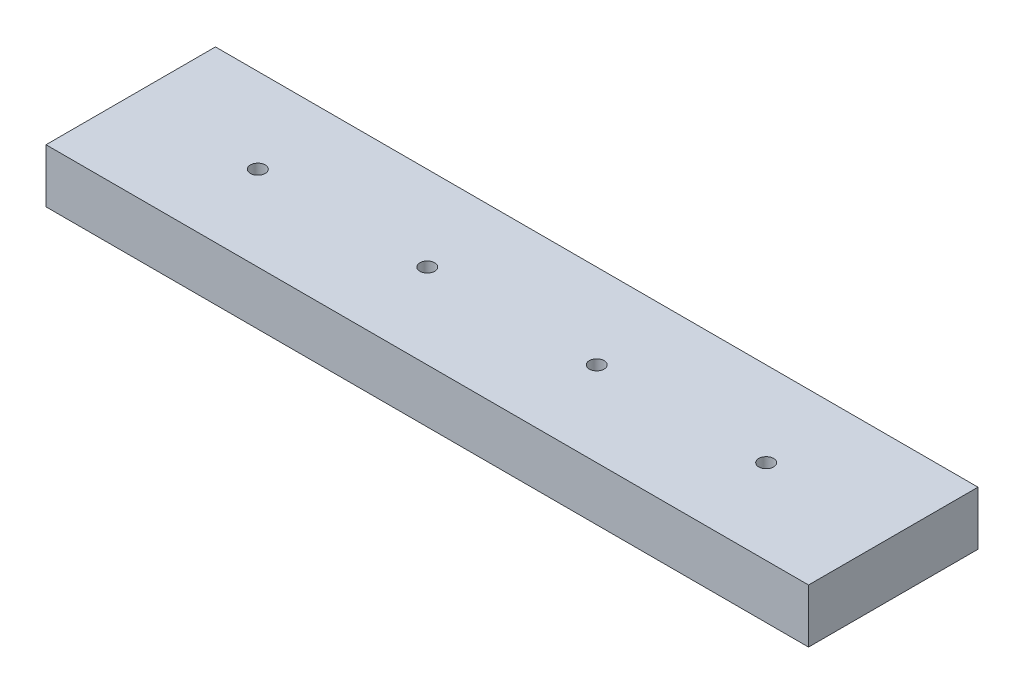
ISO-10303-21;
HEADER;
FILE_DESCRIPTION(('STEP AP214'),'2;1');
FILE_NAME('part.step','',(''),(''),'','','');
FILE_SCHEMA(('AUTOMOTIVE_DESIGN { 1 0 10303 214 1 1 1 1 }'));
ENDSEC;
DATA;
#1=APPLICATION_CONTEXT('core data for automotive mechanical design processes');
#2=APPLICATION_PROTOCOL_DEFINITION('international standard','automotive_design',2000,#1);
#3=PRODUCT_CONTEXT('',#1,'mechanical');
#4=PRODUCT('Part','Part','',(#3));
#5=PRODUCT_RELATED_PRODUCT_CATEGORY('part','',(#4));
#6=PRODUCT_DEFINITION_FORMATION('','',#4);
#7=PRODUCT_DEFINITION_CONTEXT('part definition',#1,'design');
#8=PRODUCT_DEFINITION('design','',#6,#7);
#9=PRODUCT_DEFINITION_SHAPE('','',#8);
#10=(LENGTH_UNIT() NAMED_UNIT(*) SI_UNIT(.MILLI.,.METRE.));
#11=(NAMED_UNIT(*) PLANE_ANGLE_UNIT() SI_UNIT($,.RADIAN.));
#12=(NAMED_UNIT(*) SI_UNIT($,.STERADIAN.) SOLID_ANGLE_UNIT());
#13=UNCERTAINTY_MEASURE_WITH_UNIT(LENGTH_MEASURE(1.E-05),#10,'distance_accuracy_value','');
#14=(GEOMETRIC_REPRESENTATION_CONTEXT(3) GLOBAL_UNCERTAINTY_ASSIGNED_CONTEXT((#13)) GLOBAL_UNIT_ASSIGNED_CONTEXT((#10,
#11,#12)) REPRESENTATION_CONTEXT('',''));
#15=CARTESIAN_POINT('',(0.,0.,0.));
#16=DIRECTION('',(0.,0.,1.));
#17=DIRECTION('',(1.,0.,0.));
#18=AXIS2_PLACEMENT_3D('',#15,#16,#17);
#19=CARTESIAN_POINT('',(-45.,6.35,10.));
#20=DIRECTION('',(1.,0.,0.));
#21=DIRECTION('',(0.,0.,-1.));
#22=AXIS2_PLACEMENT_3D('',#19,#20,#21);
#23=PLANE('',#22);
#24=DIRECTION('',(0.,0.,1.));
#25=VECTOR('',#24,1.);
#26=CARTESIAN_POINT('',(-45.,0.,10.));
#27=LINE('',#26,#25);
#28=CARTESIAN_POINT('',(-45.,0.,-9.99999999999999));
#29=VERTEX_POINT('',#28);
#30=CARTESIAN_POINT('',(-45.,0.,10.));
#31=VERTEX_POINT('',#30);
#32=EDGE_CURVE('E96',#29,#31,#27,.T.);
#33=ORIENTED_EDGE('',*,*,#32,.T.);
#34=DIRECTION('',(0.,-1.,0.));
#35=VECTOR('',#34,1.);
#36=CARTESIAN_POINT('',(-45.,6.35,10.));
#37=LINE('',#36,#35);
#38=CARTESIAN_POINT('',(-45.,6.35,10.));
#39=VERTEX_POINT('',#38);
#40=EDGE_CURVE('E11',#39,#31,#37,.T.);
#41=ORIENTED_EDGE('',*,*,#40,.F.);
#42=DIRECTION('',(0.,0.,1.));
#43=VECTOR('',#42,1.);
#44=CARTESIAN_POINT('',(-45.,6.35,10.));
#45=LINE('',#44,#43);
#46=CARTESIAN_POINT('',(-45.,6.35,-9.99999999999999));
#47=VERTEX_POINT('',#46);
#48=EDGE_CURVE('E84',#47,#39,#45,.T.);
#49=ORIENTED_EDGE('',*,*,#48,.F.);
#50=DIRECTION('',(0.,-1.,0.));
#51=VECTOR('',#50,1.);
#52=CARTESIAN_POINT('',(-45.,6.35,-9.99999999999999));
#53=LINE('',#52,#51);
#54=EDGE_CURVE('E92',#47,#29,#53,.T.);
#55=ORIENTED_EDGE('',*,*,#54,.T.);
#56=EDGE_LOOP('',(#33,#41,#49,#55));
#57=FACE_BOUND('',#56,.T.);
#58=ADVANCED_FACE('F33',(#57),#23,.F.);
#59=CARTESIAN_POINT('',(45.,6.35,9.99999999999999));
#60=DIRECTION('',(0.,0.,-1.));
#61=DIRECTION('',(-1.,0.,0.));
#62=AXIS2_PLACEMENT_3D('',#59,#60,#61);
#63=PLANE('',#62);
#64=DIRECTION('',(1.,0.,0.));
#65=VECTOR('',#64,1.);
#66=CARTESIAN_POINT('',(45.,0.,9.99999999999999));
#67=LINE('',#66,#65);
#68=CARTESIAN_POINT('',(45.,0.,9.99999999999999));
#69=VERTEX_POINT('',#68);
#70=EDGE_CURVE('E88',#31,#69,#67,.T.);
#71=ORIENTED_EDGE('',*,*,#70,.T.);
#72=DIRECTION('',(0.,-1.,0.));
#73=VECTOR('',#72,1.);
#74=CARTESIAN_POINT('',(45.,6.35,9.99999999999999));
#75=LINE('',#74,#73);
#76=CARTESIAN_POINT('',(45.,6.35,9.99999999999999));
#77=VERTEX_POINT('',#76);
#78=EDGE_CURVE('E41',#77,#69,#75,.T.);
#79=ORIENTED_EDGE('',*,*,#78,.F.);
#80=DIRECTION('',(1.,0.,0.));
#81=VECTOR('',#80,1.);
#82=CARTESIAN_POINT('',(45.,6.35,9.99999999999999));
#83=LINE('',#82,#81);
#84=EDGE_CURVE('E79',#39,#77,#83,.T.);
#85=ORIENTED_EDGE('',*,*,#84,.F.);
#86=ORIENTED_EDGE('',*,*,#40,.T.);
#87=EDGE_LOOP('',(#71,#79,#85,#86));
#88=FACE_BOUND('',#87,.T.);
#89=ADVANCED_FACE('F87',(#88),#63,.F.);
#90=CARTESIAN_POINT('',(45.,6.35,9.99999999999999));
#91=DIRECTION('',(-1.,0.,0.));
#92=DIRECTION('',(0.,0.,1.));
#93=AXIS2_PLACEMENT_3D('',#90,#91,#92);
#94=PLANE('',#93);
#95=DIRECTION('',(0.,0.,-1.));
#96=VECTOR('',#95,1.);
#97=CARTESIAN_POINT('',(45.,0.,9.99999999999999));
#98=LINE('',#97,#96);
#99=CARTESIAN_POINT('',(45.,0.,-10.));
#100=VERTEX_POINT('',#99);
#101=EDGE_CURVE('E66',#69,#100,#98,.T.);
#102=ORIENTED_EDGE('',*,*,#101,.T.);
#103=DIRECTION('',(0.,-1.,0.));
#104=VECTOR('',#103,1.);
#105=CARTESIAN_POINT('',(45.,6.35,-10.));
#106=LINE('',#105,#104);
#107=CARTESIAN_POINT('',(45.,6.35,-10.));
#108=VERTEX_POINT('',#107);
#109=EDGE_CURVE('E89',#108,#100,#106,.T.);
#110=ORIENTED_EDGE('',*,*,#109,.F.);
#111=DIRECTION('',(0.,0.,-1.));
#112=VECTOR('',#111,1.);
#113=CARTESIAN_POINT('',(45.,6.35,9.99999999999999));
#114=LINE('',#113,#112);
#115=EDGE_CURVE('E82',#77,#108,#114,.T.);
#116=ORIENTED_EDGE('',*,*,#115,.F.);
#117=ORIENTED_EDGE('',*,*,#78,.T.);
#118=EDGE_LOOP('',(#102,#110,#116,#117));
#119=FACE_BOUND('',#118,.T.);
#120=ADVANCED_FACE('F90',(#119),#94,.F.);
#121=CARTESIAN_POINT('',(45.,6.35,-10.));
#122=DIRECTION('',(0.,0.,1.));
#123=DIRECTION('',(1.,0.,0.));
#124=AXIS2_PLACEMENT_3D('',#121,#122,#123);
#125=PLANE('',#124);
#126=DIRECTION('',(-1.,0.,0.));
#127=VECTOR('',#126,1.);
#128=CARTESIAN_POINT('',(45.,0.,-10.));
#129=LINE('',#128,#127);
#130=EDGE_CURVE('E72',#100,#29,#129,.T.);
#131=ORIENTED_EDGE('',*,*,#130,.T.);
#132=ORIENTED_EDGE('',*,*,#54,.F.);
#133=DIRECTION('',(-1.,0.,0.));
#134=VECTOR('',#133,1.);
#135=CARTESIAN_POINT('',(45.,6.35,-10.));
#136=LINE('',#135,#134);
#137=EDGE_CURVE('E49',#108,#47,#136,.T.);
#138=ORIENTED_EDGE('',*,*,#137,.F.);
#139=ORIENTED_EDGE('',*,*,#109,.T.);
#140=EDGE_LOOP('',(#131,#132,#138,#139));
#141=FACE_BOUND('',#140,.T.);
#142=ADVANCED_FACE('F104',(#141),#125,.F.);
#143=CARTESIAN_POINT('',(0.,6.35,0.));
#144=DIRECTION('',(0.,1.,0.));
#145=DIRECTION('',(0.,0.,1.));
#146=AXIS2_PLACEMENT_3D('',#143,#144,#145);
#147=PLANE('',#146);
#148=CARTESIAN_POINT('',(-30.,6.35,0.));
#149=DIRECTION('',(0.,1.,0.));
#150=DIRECTION('',(0.,0.,1.));
#151=AXIS2_PLACEMENT_3D('',#148,#149,#150);
#152=CIRCLE('',#151,0.875000000000001);
#153=CARTESIAN_POINT('',(-30.,6.35,0.874999999999994));
#154=VERTEX_POINT('',#153);
#155=EDGE_CURVE('E130',#154,#154,#152,.T.);
#156=ORIENTED_EDGE('',*,*,#155,.F.);
#157=EDGE_LOOP('',(#156));
#158=FACE_BOUND('',#157,.T.);
#159=CARTESIAN_POINT('',(-10.,6.35,0.));
#160=DIRECTION('',(0.,1.,0.));
#161=DIRECTION('',(0.,0.,1.));
#162=AXIS2_PLACEMENT_3D('',#159,#160,#161);
#163=CIRCLE('',#162,0.874999999999999);
#164=CARTESIAN_POINT('',(-10.,6.35,0.874999999999992));
#165=VERTEX_POINT('',#164);
#166=EDGE_CURVE('E124',#165,#165,#163,.T.);
#167=ORIENTED_EDGE('',*,*,#166,.F.);
#168=EDGE_LOOP('',(#167));
#169=FACE_BOUND('',#168,.T.);
#170=CARTESIAN_POINT('',(30.,6.35,0.));
#171=DIRECTION('',(0.,1.,0.));
#172=DIRECTION('',(0.,0.,1.));
#173=AXIS2_PLACEMENT_3D('',#170,#171,#172);
#174=CIRCLE('',#173,0.875000000000001);
#175=CARTESIAN_POINT('',(30.,6.35,0.874999999999987));
#176=VERTEX_POINT('',#175);
#177=EDGE_CURVE('E118',#176,#176,#174,.T.);
#178=ORIENTED_EDGE('',*,*,#177,.F.);
#179=EDGE_LOOP('',(#178));
#180=FACE_BOUND('',#179,.T.);
#181=CARTESIAN_POINT('',(10.,6.35,0.));
#182=DIRECTION('',(0.,1.,0.));
#183=DIRECTION('',(0.,0.,1.));
#184=AXIS2_PLACEMENT_3D('',#181,#182,#183);
#185=CIRCLE('',#184,0.874999999999999);
#186=CARTESIAN_POINT('',(10.,6.35,0.874999999999989));
#187=VERTEX_POINT('',#186);
#188=EDGE_CURVE('E112',#187,#187,#185,.T.);
#189=ORIENTED_EDGE('',*,*,#188,.F.);
#190=EDGE_LOOP('',(#189));
#191=FACE_BOUND('',#190,.T.);
#192=ORIENTED_EDGE('',*,*,#48,.T.);
#193=ORIENTED_EDGE('',*,*,#84,.T.);
#194=ORIENTED_EDGE('',*,*,#115,.T.);
#195=ORIENTED_EDGE('',*,*,#137,.T.);
#196=EDGE_LOOP('',(#192,#193,#194,#195));
#197=FACE_BOUND('',#196,.T.);
#198=ADVANCED_FACE('F80',(#158,#169,#180,#191,#197),#147,.T.);
#199=CARTESIAN_POINT('',(0.,0.,0.));
#200=DIRECTION('',(0.,1.,0.));
#201=DIRECTION('',(0.,0.,1.));
#202=AXIS2_PLACEMENT_3D('',#199,#200,#201);
#203=PLANE('',#202);
#204=CARTESIAN_POINT('',(-30.,0.,0.));
#205=DIRECTION('',(0.,1.,0.));
#206=DIRECTION('',(0.,0.,1.));
#207=AXIS2_PLACEMENT_3D('',#204,#205,#206);
#208=CIRCLE('',#207,0.874999999999997);
#209=CARTESIAN_POINT('',(-30.,0.,0.87499999999999));
#210=VERTEX_POINT('',#209);
#211=EDGE_CURVE('E127',#210,#210,#208,.T.);
#212=ORIENTED_EDGE('',*,*,#211,.T.);
#213=EDGE_LOOP('',(#212));
#214=FACE_BOUND('',#213,.T.);
#215=CARTESIAN_POINT('',(-10.,0.,0.));
#216=DIRECTION('',(0.,1.,0.));
#217=DIRECTION('',(0.,0.,1.));
#218=AXIS2_PLACEMENT_3D('',#215,#216,#217);
#219=CIRCLE('',#218,0.874999999999999);
#220=CARTESIAN_POINT('',(-10.,0.,0.874999999999992));
#221=VERTEX_POINT('',#220);
#222=EDGE_CURVE('E121',#221,#221,#219,.T.);
#223=ORIENTED_EDGE('',*,*,#222,.T.);
#224=EDGE_LOOP('',(#223));
#225=FACE_BOUND('',#224,.T.);
#226=CARTESIAN_POINT('',(30.,0.,0.));
#227=DIRECTION('',(0.,1.,0.));
#228=DIRECTION('',(0.,0.,1.));
#229=AXIS2_PLACEMENT_3D('',#226,#227,#228);
#230=CIRCLE('',#229,0.874999999999997);
#231=CARTESIAN_POINT('',(30.,0.,0.874999999999983));
#232=VERTEX_POINT('',#231);
#233=EDGE_CURVE('E115',#232,#232,#230,.T.);
#234=ORIENTED_EDGE('',*,*,#233,.T.);
#235=EDGE_LOOP('',(#234));
#236=FACE_BOUND('',#235,.T.);
#237=CARTESIAN_POINT('',(10.,0.,0.));
#238=DIRECTION('',(0.,1.,0.));
#239=DIRECTION('',(0.,0.,1.));
#240=AXIS2_PLACEMENT_3D('',#237,#238,#239);
#241=CIRCLE('',#240,0.874999999999999);
#242=CARTESIAN_POINT('',(10.,0.,0.874999999999989));
#243=VERTEX_POINT('',#242);
#244=EDGE_CURVE('E99',#243,#243,#241,.T.);
#245=ORIENTED_EDGE('',*,*,#244,.T.);
#246=EDGE_LOOP('',(#245));
#247=FACE_BOUND('',#246,.T.);
#248=ORIENTED_EDGE('',*,*,#32,.F.);
#249=ORIENTED_EDGE('',*,*,#130,.F.);
#250=ORIENTED_EDGE('',*,*,#101,.F.);
#251=ORIENTED_EDGE('',*,*,#70,.F.);
#252=EDGE_LOOP('',(#248,#249,#250,#251));
#253=FACE_BOUND('',#252,.T.);
#254=ADVANCED_FACE('F107',(#214,#225,#236,#247,#253),#203,.F.);
#255=CARTESIAN_POINT('',(10.,6.35,0.));
#256=DIRECTION('',(0.,1.,0.));
#257=DIRECTION('',(0.,0.,1.));
#258=AXIS2_PLACEMENT_3D('',#255,#256,#257);
#259=CYLINDRICAL_SURFACE('',#258,0.874999999999999);
#260=ORIENTED_EDGE('',*,*,#244,.F.);
#261=EDGE_LOOP('',(#260));
#262=FACE_BOUND('',#261,.T.);
#263=ORIENTED_EDGE('',*,*,#188,.T.);
#264=EDGE_LOOP('',(#263));
#265=FACE_BOUND('',#264,.T.);
#266=ADVANCED_FACE('F145',(#262,#265),#259,.F.);
#267=CARTESIAN_POINT('',(30.,6.35,0.));
#268=DIRECTION('',(0.,1.,0.));
#269=DIRECTION('',(0.,0.,1.));
#270=AXIS2_PLACEMENT_3D('',#267,#268,#269);
#271=CYLINDRICAL_SURFACE('',#270,0.874999999999999);
#272=ORIENTED_EDGE('',*,*,#233,.F.);
#273=EDGE_LOOP('',(#272));
#274=FACE_BOUND('',#273,.T.);
#275=ORIENTED_EDGE('',*,*,#177,.T.);
#276=EDGE_LOOP('',(#275));
#277=FACE_BOUND('',#276,.T.);
#278=ADVANCED_FACE('F147',(#274,#277),#271,.F.);
#279=CARTESIAN_POINT('',(-10.,6.35,0.));
#280=DIRECTION('',(0.,1.,0.));
#281=DIRECTION('',(0.,0.,1.));
#282=AXIS2_PLACEMENT_3D('',#279,#280,#281);
#283=CYLINDRICAL_SURFACE('',#282,0.874999999999999);
#284=ORIENTED_EDGE('',*,*,#222,.F.);
#285=EDGE_LOOP('',(#284));
#286=FACE_BOUND('',#285,.T.);
#287=ORIENTED_EDGE('',*,*,#166,.T.);
#288=EDGE_LOOP('',(#287));
#289=FACE_BOUND('',#288,.T.);
#290=ADVANCED_FACE('F154',(#286,#289),#283,.F.);
#291=CARTESIAN_POINT('',(-30.,6.35,0.));
#292=DIRECTION('',(0.,1.,0.));
#293=DIRECTION('',(0.,0.,1.));
#294=AXIS2_PLACEMENT_3D('',#291,#292,#293);
#295=CYLINDRICAL_SURFACE('',#294,0.874999999999999);
#296=ORIENTED_EDGE('',*,*,#211,.F.);
#297=EDGE_LOOP('',(#296));
#298=FACE_BOUND('',#297,.T.);
#299=ORIENTED_EDGE('',*,*,#155,.T.);
#300=EDGE_LOOP('',(#299));
#301=FACE_BOUND('',#300,.T.);
#302=ADVANCED_FACE('F134',(#298,#301),#295,.F.);
#303=CLOSED_SHELL('',(#58,#89,#120,#142,#198,#254,#266,#278,#290,#302));
#304=MANIFOLD_SOLID_BREP('B2',#303);
#305=ADVANCED_BREP_SHAPE_REPRESENTATION('',(#18,#304),#14);
#306=SHAPE_DEFINITION_REPRESENTATION(#9,#305);
ENDSEC;
END-ISO-10303-21;
